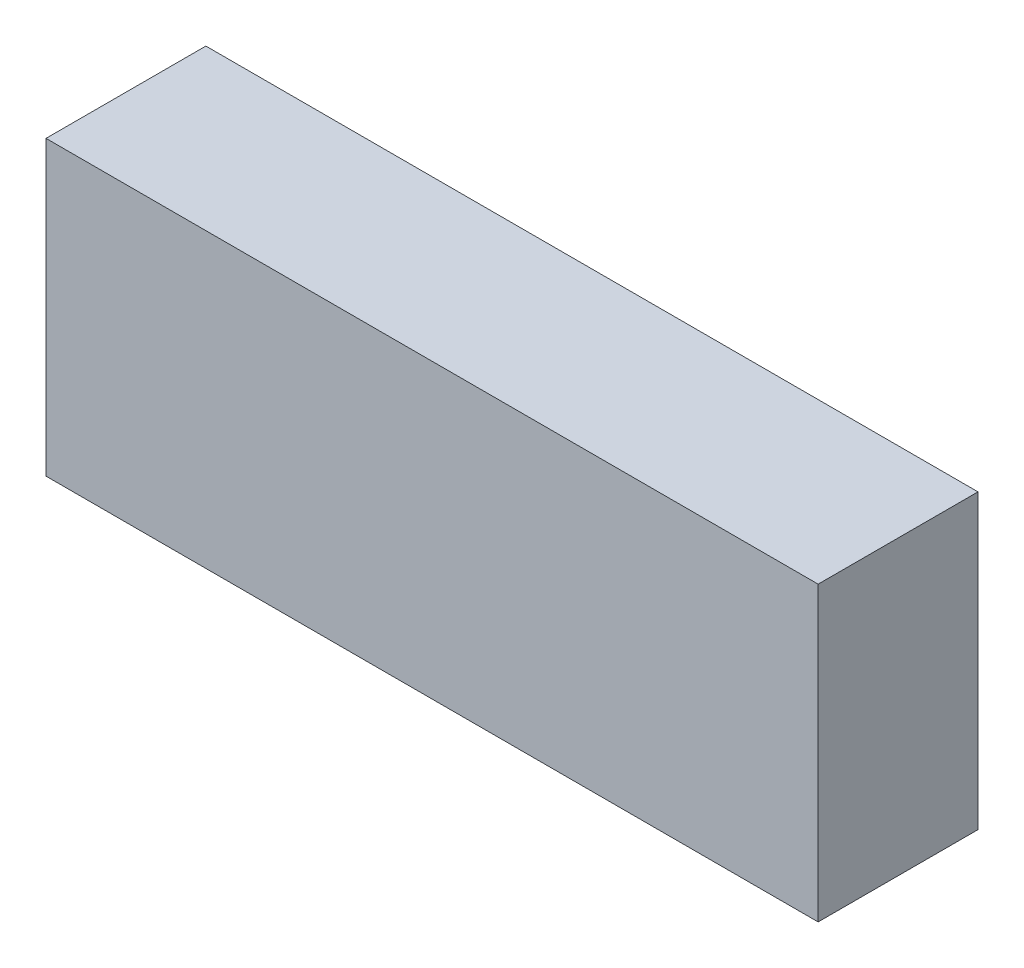
ISO-10303-21;
HEADER;
FILE_DESCRIPTION(('STEP AP214'),'2;1');
FILE_NAME('part.step','',(''),(''),'','','');
FILE_SCHEMA(('AUTOMOTIVE_DESIGN { 1 0 10303 214 1 1 1 1 }'));
ENDSEC;
DATA;
#1=APPLICATION_CONTEXT('core data for automotive mechanical design processes');
#2=APPLICATION_PROTOCOL_DEFINITION('international standard','automotive_design',2000,#1);
#3=PRODUCT_CONTEXT('',#1,'mechanical');
#4=PRODUCT('Part','Part','',(#3));
#5=PRODUCT_RELATED_PRODUCT_CATEGORY('part','',(#4));
#6=PRODUCT_DEFINITION_FORMATION('','',#4);
#7=PRODUCT_DEFINITION_CONTEXT('part definition',#1,'design');
#8=PRODUCT_DEFINITION('design','',#6,#7);
#9=PRODUCT_DEFINITION_SHAPE('','',#8);
#10=(LENGTH_UNIT() NAMED_UNIT(*) SI_UNIT(.MILLI.,.METRE.));
#11=(NAMED_UNIT(*) PLANE_ANGLE_UNIT() SI_UNIT($,.RADIAN.));
#12=(NAMED_UNIT(*) SI_UNIT($,.STERADIAN.) SOLID_ANGLE_UNIT());
#13=UNCERTAINTY_MEASURE_WITH_UNIT(LENGTH_MEASURE(1.E-05),#10,'distance_accuracy_value','');
#14=(GEOMETRIC_REPRESENTATION_CONTEXT(3) GLOBAL_UNCERTAINTY_ASSIGNED_CONTEXT((#13)) GLOBAL_UNIT_ASSIGNED_CONTEXT((#10,
#11,#12)) REPRESENTATION_CONTEXT('',''));
#15=CARTESIAN_POINT('',(0.,0.,0.));
#16=DIRECTION('',(0.,0.,1.));
#17=DIRECTION('',(1.,0.,0.));
#18=AXIS2_PLACEMENT_3D('',#15,#16,#17);
#19=CARTESIAN_POINT('',(-24.15,18.3,10.));
#20=DIRECTION('',(1.,0.,0.));
#21=DIRECTION('',(0.,0.,-1.));
#22=AXIS2_PLACEMENT_3D('',#19,#20,#21);
#23=PLANE('',#22);
#24=DIRECTION('',(0.,-1.,0.));
#25=VECTOR('',#24,1.);
#26=CARTESIAN_POINT('',(-24.15,18.3,0.));
#27=LINE('',#26,#25);
#28=CARTESIAN_POINT('',(-24.15,18.3,0.));
#29=VERTEX_POINT('',#28);
#30=CARTESIAN_POINT('',(-24.15,0.,0.));
#31=VERTEX_POINT('',#30);
#32=EDGE_CURVE('E98',#29,#31,#27,.T.);
#33=ORIENTED_EDGE('',*,*,#32,.T.);
#34=DIRECTION('',(0.,0.,-1.));
#35=VECTOR('',#34,1.);
#36=CARTESIAN_POINT('',(-24.15,0.,10.));
#37=LINE('',#36,#35);
#38=CARTESIAN_POINT('',(-24.15,0.,10.));
#39=VERTEX_POINT('',#38);
#40=EDGE_CURVE('E11',#39,#31,#37,.T.);
#41=ORIENTED_EDGE('',*,*,#40,.F.);
#42=DIRECTION('',(0.,-1.,0.));
#43=VECTOR('',#42,1.);
#44=CARTESIAN_POINT('',(-24.15,18.3,10.));
#45=LINE('',#44,#43);
#46=CARTESIAN_POINT('',(-24.15,18.3,10.));
#47=VERTEX_POINT('',#46);
#48=EDGE_CURVE('E86',#47,#39,#45,.T.);
#49=ORIENTED_EDGE('',*,*,#48,.F.);
#50=DIRECTION('',(0.,0.,-1.));
#51=VECTOR('',#50,1.);
#52=CARTESIAN_POINT('',(-24.15,18.3,10.));
#53=LINE('',#52,#51);
#54=EDGE_CURVE('E94',#47,#29,#53,.T.);
#55=ORIENTED_EDGE('',*,*,#54,.T.);
#56=EDGE_LOOP('',(#33,#41,#49,#55));
#57=FACE_BOUND('',#56,.T.);
#58=ADVANCED_FACE('F35',(#57),#23,.F.);
#59=CARTESIAN_POINT('',(24.15,0.,10.));
#60=DIRECTION('',(0.,1.,0.));
#61=DIRECTION('',(0.,0.,1.));
#62=AXIS2_PLACEMENT_3D('',#59,#60,#61);
#63=PLANE('',#62);
#64=DIRECTION('',(1.,0.,0.));
#65=VECTOR('',#64,1.);
#66=CARTESIAN_POINT('',(24.15,0.,0.));
#67=LINE('',#66,#65);
#68=CARTESIAN_POINT('',(24.15,0.,0.));
#69=VERTEX_POINT('',#68);
#70=EDGE_CURVE('E90',#31,#69,#67,.T.);
#71=ORIENTED_EDGE('',*,*,#70,.T.);
#72=DIRECTION('',(0.,0.,-1.));
#73=VECTOR('',#72,1.);
#74=CARTESIAN_POINT('',(24.15,0.,10.));
#75=LINE('',#74,#73);
#76=CARTESIAN_POINT('',(24.15,0.,10.));
#77=VERTEX_POINT('',#76);
#78=EDGE_CURVE('E43',#77,#69,#75,.T.);
#79=ORIENTED_EDGE('',*,*,#78,.F.);
#80=DIRECTION('',(1.,0.,0.));
#81=VECTOR('',#80,1.);
#82=CARTESIAN_POINT('',(24.15,0.,10.));
#83=LINE('',#82,#81);
#84=EDGE_CURVE('E81',#39,#77,#83,.T.);
#85=ORIENTED_EDGE('',*,*,#84,.F.);
#86=ORIENTED_EDGE('',*,*,#40,.T.);
#87=EDGE_LOOP('',(#71,#79,#85,#86));
#88=FACE_BOUND('',#87,.T.);
#89=ADVANCED_FACE('F89',(#88),#63,.F.);
#90=CARTESIAN_POINT('',(24.15,18.3,10.));
#91=DIRECTION('',(-1.,0.,0.));
#92=DIRECTION('',(0.,-1.,0.));
#93=AXIS2_PLACEMENT_3D('',#90,#91,#92);
#94=PLANE('',#93);
#95=DIRECTION('',(0.,1.,0.));
#96=VECTOR('',#95,1.);
#97=CARTESIAN_POINT('',(24.15,18.3,0.));
#98=LINE('',#97,#96);
#99=CARTESIAN_POINT('',(24.15,18.3,0.));
#100=VERTEX_POINT('',#99);
#101=EDGE_CURVE('E68',#69,#100,#98,.T.);
#102=ORIENTED_EDGE('',*,*,#101,.T.);
#103=DIRECTION('',(0.,0.,-1.));
#104=VECTOR('',#103,1.);
#105=CARTESIAN_POINT('',(24.15,18.3,10.));
#106=LINE('',#105,#104);
#107=CARTESIAN_POINT('',(24.15,18.3,10.));
#108=VERTEX_POINT('',#107);
#109=EDGE_CURVE('E91',#108,#100,#106,.T.);
#110=ORIENTED_EDGE('',*,*,#109,.F.);
#111=DIRECTION('',(0.,1.,0.));
#112=VECTOR('',#111,1.);
#113=CARTESIAN_POINT('',(24.15,18.3,10.));
#114=LINE('',#113,#112);
#115=EDGE_CURVE('E84',#77,#108,#114,.T.);
#116=ORIENTED_EDGE('',*,*,#115,.F.);
#117=ORIENTED_EDGE('',*,*,#78,.T.);
#118=EDGE_LOOP('',(#102,#110,#116,#117));
#119=FACE_BOUND('',#118,.T.);
#120=ADVANCED_FACE('F92',(#119),#94,.F.);
#121=CARTESIAN_POINT('',(24.15,18.3,10.));
#122=DIRECTION('',(0.,-1.,0.));
#123=DIRECTION('',(0.,0.,-1.));
#124=AXIS2_PLACEMENT_3D('',#121,#122,#123);
#125=PLANE('',#124);
#126=DIRECTION('',(-1.,0.,0.));
#127=VECTOR('',#126,1.);
#128=CARTESIAN_POINT('',(24.15,18.3,0.));
#129=LINE('',#128,#127);
#130=EDGE_CURVE('E74',#100,#29,#129,.T.);
#131=ORIENTED_EDGE('',*,*,#130,.T.);
#132=ORIENTED_EDGE('',*,*,#54,.F.);
#133=DIRECTION('',(-1.,0.,0.));
#134=VECTOR('',#133,1.);
#135=CARTESIAN_POINT('',(24.15,18.3,10.));
#136=LINE('',#135,#134);
#137=EDGE_CURVE('E51',#108,#47,#136,.T.);
#138=ORIENTED_EDGE('',*,*,#137,.F.);
#139=ORIENTED_EDGE('',*,*,#109,.T.);
#140=EDGE_LOOP('',(#131,#132,#138,#139));
#141=FACE_BOUND('',#140,.T.);
#142=ADVANCED_FACE('F105',(#141),#125,.F.);
#143=CARTESIAN_POINT('',(0.,0.,10.));
#144=DIRECTION('',(0.,0.,-1.));
#145=DIRECTION('',(-1.,0.,0.));
#146=AXIS2_PLACEMENT_3D('',#143,#144,#145);
#147=PLANE('',#146);
#148=ORIENTED_EDGE('',*,*,#48,.T.);
#149=ORIENTED_EDGE('',*,*,#84,.T.);
#150=ORIENTED_EDGE('',*,*,#115,.T.);
#151=ORIENTED_EDGE('',*,*,#137,.T.);
#152=EDGE_LOOP('',(#148,#149,#150,#151));
#153=FACE_BOUND('',#152,.T.);
#154=ADVANCED_FACE('F82',(#153),#147,.F.);
#155=CARTESIAN_POINT('',(0.,0.,0.));
#156=DIRECTION('',(0.,0.,-1.));
#157=DIRECTION('',(-1.,0.,0.));
#158=AXIS2_PLACEMENT_3D('',#155,#156,#157);
#159=PLANE('',#158);
#160=ORIENTED_EDGE('',*,*,#32,.F.);
#161=ORIENTED_EDGE('',*,*,#130,.F.);
#162=ORIENTED_EDGE('',*,*,#101,.F.);
#163=ORIENTED_EDGE('',*,*,#70,.F.);
#164=EDGE_LOOP('',(#160,#161,#162,#163));
#165=FACE_BOUND('',#164,.T.);
#166=ADVANCED_FACE('F108',(#165),#159,.T.);
#167=CLOSED_SHELL('',(#58,#89,#120,#142,#154,#166));
#168=MANIFOLD_SOLID_BREP('B2',#167);
#169=ADVANCED_BREP_SHAPE_REPRESENTATION('',(#18,#168),#14);
#170=SHAPE_DEFINITION_REPRESENTATION(#9,#169);
ENDSEC;
END-ISO-10303-21;
